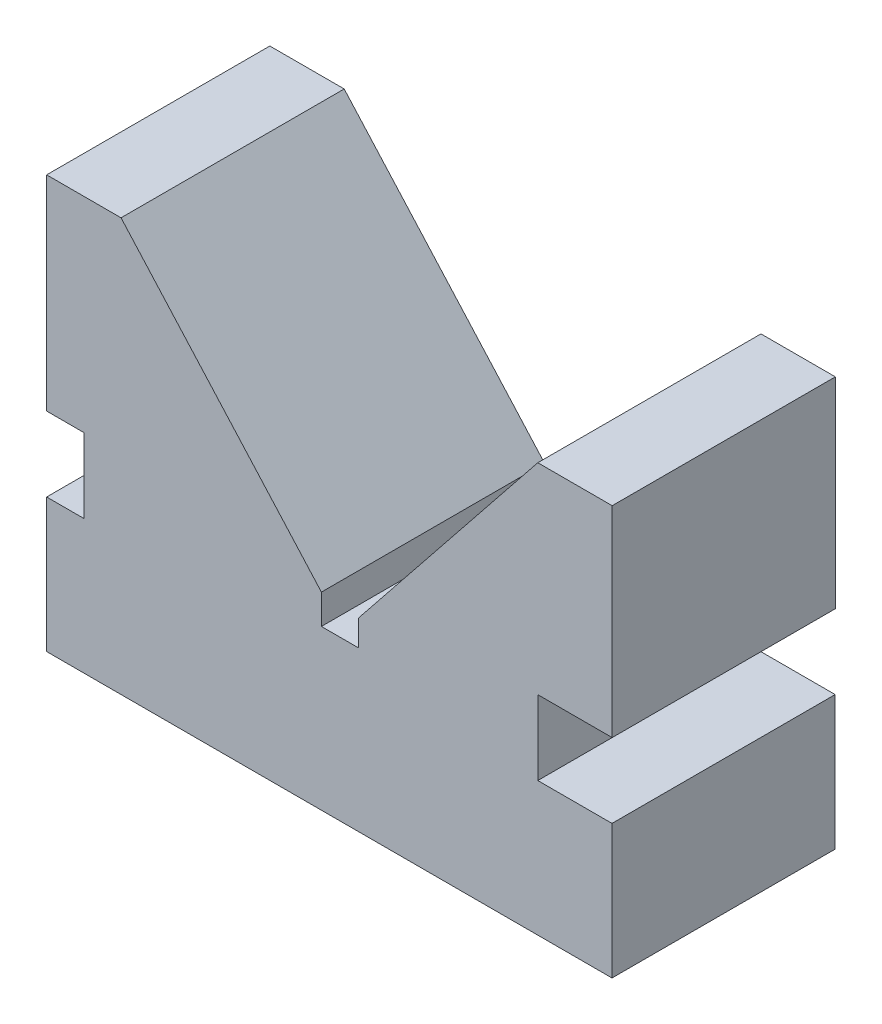
ISO-10303-21;
HEADER;
FILE_DESCRIPTION(('STEP AP214'),'2;1');
FILE_NAME('part.step','',(''),(''),'','','');
FILE_SCHEMA(('AUTOMOTIVE_DESIGN { 1 0 10303 214 1 1 1 1 }'));
ENDSEC;
DATA;
#1=APPLICATION_CONTEXT('core data for automotive mechanical design processes');
#2=APPLICATION_PROTOCOL_DEFINITION('international standard','automotive_design',2000,#1);
#3=PRODUCT_CONTEXT('',#1,'mechanical');
#4=PRODUCT('Part','Part','',(#3));
#5=PRODUCT_RELATED_PRODUCT_CATEGORY('part','',(#4));
#6=PRODUCT_DEFINITION_FORMATION('','',#4);
#7=PRODUCT_DEFINITION_CONTEXT('part definition',#1,'design');
#8=PRODUCT_DEFINITION('design','',#6,#7);
#9=PRODUCT_DEFINITION_SHAPE('','',#8);
#10=(LENGTH_UNIT() NAMED_UNIT(*) SI_UNIT(.MILLI.,.METRE.));
#11=(NAMED_UNIT(*) PLANE_ANGLE_UNIT() SI_UNIT($,.RADIAN.));
#12=(NAMED_UNIT(*) SI_UNIT($,.STERADIAN.) SOLID_ANGLE_UNIT());
#13=UNCERTAINTY_MEASURE_WITH_UNIT(LENGTH_MEASURE(1.E-05),#10,'distance_accuracy_value','');
#14=(GEOMETRIC_REPRESENTATION_CONTEXT(3) GLOBAL_UNCERTAINTY_ASSIGNED_CONTEXT((#13)) GLOBAL_UNIT_ASSIGNED_CONTEXT((#10,
#11,#12)) REPRESENTATION_CONTEXT('',''));
#15=CARTESIAN_POINT('',(0.,0.,0.));
#16=DIRECTION('',(0.,0.,1.));
#17=DIRECTION('',(1.,0.,0.));
#18=AXIS2_PLACEMENT_3D('',#15,#16,#17);
#19=CARTESIAN_POINT('',(5.,18.,30.));
#20=DIRECTION('',(0.,-1.,0.));
#21=DIRECTION('',(0.,0.,-1.));
#22=AXIS2_PLACEMENT_3D('',#19,#20,#21);
#23=PLANE('',#22);
#24=DIRECTION('',(-1.,0.,0.));
#25=VECTOR('',#24,1.);
#26=CARTESIAN_POINT('',(5.,18.,0.));
#27=LINE('',#26,#25);
#28=CARTESIAN_POINT('',(5.,18.,0.));
#29=VERTEX_POINT('',#28);
#30=CARTESIAN_POINT('',(0.,18.,0.));
#31=VERTEX_POINT('',#30);
#32=EDGE_CURVE('E201',#29,#31,#27,.T.);
#33=ORIENTED_EDGE('',*,*,#32,.T.);
#34=DIRECTION('',(0.,0.,-1.));
#35=VECTOR('',#34,1.);
#36=CARTESIAN_POINT('',(0.,18.,30.));
#37=LINE('',#36,#35);
#38=CARTESIAN_POINT('',(0.,18.,30.));
#39=VERTEX_POINT('',#38);
#40=EDGE_CURVE('E11',#39,#31,#37,.T.);
#41=ORIENTED_EDGE('',*,*,#40,.F.);
#42=DIRECTION('',(-1.,0.,0.));
#43=VECTOR('',#42,1.);
#44=CARTESIAN_POINT('',(5.,18.,30.));
#45=LINE('',#44,#43);
#46=CARTESIAN_POINT('',(5.,18.,30.));
#47=VERTEX_POINT('',#46);
#48=EDGE_CURVE('E253',#47,#39,#45,.T.);
#49=ORIENTED_EDGE('',*,*,#48,.F.);
#50=DIRECTION('',(0.,0.,-1.));
#51=VECTOR('',#50,1.);
#52=CARTESIAN_POINT('',(5.,18.,30.));
#53=LINE('',#52,#51);
#54=EDGE_CURVE('E197',#47,#29,#53,.T.);
#55=ORIENTED_EDGE('',*,*,#54,.T.);
#56=EDGE_LOOP('',(#33,#41,#49,#55));
#57=FACE_BOUND('',#56,.T.);
#58=ADVANCED_FACE('F40',(#57),#23,.F.);
#59=CARTESIAN_POINT('',(0.,18.,30.));
#60=DIRECTION('',(1.,0.,0.));
#61=DIRECTION('',(0.,1.,0.));
#62=AXIS2_PLACEMENT_3D('',#59,#60,#61);
#63=PLANE('',#62);
#64=DIRECTION('',(0.,-1.,0.));
#65=VECTOR('',#64,1.);
#66=CARTESIAN_POINT('',(0.,18.,0.));
#67=LINE('',#66,#65);
#68=CARTESIAN_POINT('',(0.,0.,0.));
#69=VERTEX_POINT('',#68);
#70=EDGE_CURVE('E205',#31,#69,#67,.T.);
#71=ORIENTED_EDGE('',*,*,#70,.T.);
#72=DIRECTION('',(0.,0.,-1.));
#73=VECTOR('',#72,1.);
#74=CARTESIAN_POINT('',(0.,0.,30.));
#75=LINE('',#74,#73);
#76=CARTESIAN_POINT('',(0.,0.,30.));
#77=VERTEX_POINT('',#76);
#78=EDGE_CURVE('E49',#77,#69,#75,.T.);
#79=ORIENTED_EDGE('',*,*,#78,.F.);
#80=DIRECTION('',(0.,-1.,0.));
#81=VECTOR('',#80,1.);
#82=CARTESIAN_POINT('',(0.,18.,30.));
#83=LINE('',#82,#81);
#84=EDGE_CURVE('E130',#39,#77,#83,.T.);
#85=ORIENTED_EDGE('',*,*,#84,.F.);
#86=ORIENTED_EDGE('',*,*,#40,.T.);
#87=EDGE_LOOP('',(#71,#79,#85,#86));
#88=FACE_BOUND('',#87,.T.);
#89=ADVANCED_FACE('F389',(#88),#63,.F.);
#90=CARTESIAN_POINT('',(0.,0.,30.));
#91=DIRECTION('',(0.,1.,0.));
#92=DIRECTION('',(0.,0.,1.));
#93=AXIS2_PLACEMENT_3D('',#90,#91,#92);
#94=PLANE('',#93);
#95=DIRECTION('',(1.,0.,0.));
#96=VECTOR('',#95,1.);
#97=CARTESIAN_POINT('',(0.,0.,0.));
#98=LINE('',#97,#96);
#99=CARTESIAN_POINT('',(76.,0.,0.));
#100=VERTEX_POINT('',#99);
#101=EDGE_CURVE('E208',#69,#100,#98,.T.);
#102=ORIENTED_EDGE('',*,*,#101,.T.);
#103=DIRECTION('',(0.,0.,-1.));
#104=VECTOR('',#103,1.);
#105=CARTESIAN_POINT('',(76.,0.,30.));
#106=LINE('',#105,#104);
#107=CARTESIAN_POINT('',(76.,0.,30.));
#108=VERTEX_POINT('',#107);
#109=EDGE_CURVE('E304',#108,#100,#106,.T.);
#110=ORIENTED_EDGE('',*,*,#109,.F.);
#111=DIRECTION('',(1.,0.,0.));
#112=VECTOR('',#111,1.);
#113=CARTESIAN_POINT('',(0.,0.,30.));
#114=LINE('',#113,#112);
#115=EDGE_CURVE('E314',#77,#108,#114,.T.);
#116=ORIENTED_EDGE('',*,*,#115,.F.);
#117=ORIENTED_EDGE('',*,*,#78,.T.);
#118=EDGE_LOOP('',(#102,#110,#116,#117));
#119=FACE_BOUND('',#118,.T.);
#120=ADVANCED_FACE('F312',(#119),#94,.F.);
#121=CARTESIAN_POINT('',(76.,0.,30.));
#122=DIRECTION('',(-1.,0.,0.));
#123=DIRECTION('',(0.,0.,1.));
#124=AXIS2_PLACEMENT_3D('',#121,#122,#123);
#125=PLANE('',#124);
#126=DIRECTION('',(0.,1.,0.));
#127=VECTOR('',#126,1.);
#128=CARTESIAN_POINT('',(76.,0.,0.));
#129=LINE('',#128,#127);
#130=CARTESIAN_POINT('',(76.,18.,0.));
#131=VERTEX_POINT('',#130);
#132=EDGE_CURVE('E211',#100,#131,#129,.T.);
#133=ORIENTED_EDGE('',*,*,#132,.T.);
#134=DIRECTION('',(0.,0.,-1.));
#135=VECTOR('',#134,1.);
#136=CARTESIAN_POINT('',(76.,18.,30.));
#137=LINE('',#136,#135);
#138=CARTESIAN_POINT('',(76.,18.,30.));
#139=VERTEX_POINT('',#138);
#140=EDGE_CURVE('E300',#139,#131,#137,.T.);
#141=ORIENTED_EDGE('',*,*,#140,.F.);
#142=DIRECTION('',(0.,1.,0.));
#143=VECTOR('',#142,1.);
#144=CARTESIAN_POINT('',(76.,0.,30.));
#145=LINE('',#144,#143);
#146=EDGE_CURVE('E333',#108,#139,#145,.T.);
#147=ORIENTED_EDGE('',*,*,#146,.F.);
#148=ORIENTED_EDGE('',*,*,#109,.T.);
#149=EDGE_LOOP('',(#133,#141,#147,#148));
#150=FACE_BOUND('',#149,.T.);
#151=ADVANCED_FACE('F323',(#150),#125,.F.);
#152=CARTESIAN_POINT('',(76.,18.,30.));
#153=DIRECTION('',(0.,-1.,0.));
#154=DIRECTION('',(0.,0.,-1.));
#155=AXIS2_PLACEMENT_3D('',#152,#153,#154);
#156=PLANE('',#155);
#157=DIRECTION('',(-1.,0.,0.));
#158=VECTOR('',#157,1.);
#159=CARTESIAN_POINT('',(76.,18.,0.));
#160=LINE('',#159,#158);
#161=CARTESIAN_POINT('',(66.0238663484487,18.,0.));
#162=VERTEX_POINT('',#161);
#163=EDGE_CURVE('E214',#131,#162,#160,.T.);
#164=ORIENTED_EDGE('',*,*,#163,.T.);
#165=DIRECTION('',(0.,0.,-1.));
#166=VECTOR('',#165,1.);
#167=CARTESIAN_POINT('',(66.0238663484487,18.,30.));
#168=LINE('',#167,#166);
#169=CARTESIAN_POINT('',(66.0238663484487,18.,30.));
#170=VERTEX_POINT('',#169);
#171=EDGE_CURVE('E296',#170,#162,#168,.T.);
#172=ORIENTED_EDGE('',*,*,#171,.F.);
#173=DIRECTION('',(-1.,0.,0.));
#174=VECTOR('',#173,1.);
#175=CARTESIAN_POINT('',(76.,18.,30.));
#176=LINE('',#175,#174);
#177=EDGE_CURVE('E329',#139,#170,#176,.T.);
#178=ORIENTED_EDGE('',*,*,#177,.F.);
#179=ORIENTED_EDGE('',*,*,#140,.T.);
#180=EDGE_LOOP('',(#164,#172,#178,#179));
#181=FACE_BOUND('',#180,.T.);
#182=ADVANCED_FACE('F327',(#181),#156,.F.);
#183=CARTESIAN_POINT('',(66.0238663484487,18.,30.));
#184=DIRECTION('',(-1.,0.,0.));
#185=DIRECTION('',(0.,0.,1.));
#186=AXIS2_PLACEMENT_3D('',#183,#184,#185);
#187=PLANE('',#186);
#188=DIRECTION('',(0.,1.,0.));
#189=VECTOR('',#188,1.);
#190=CARTESIAN_POINT('',(66.0238663484487,18.,0.));
#191=LINE('',#190,#189);
#192=CARTESIAN_POINT('',(66.0238663484487,28.,0.));
#193=VERTEX_POINT('',#192);
#194=EDGE_CURVE('E217',#162,#193,#191,.T.);
#195=ORIENTED_EDGE('',*,*,#194,.T.);
#196=DIRECTION('',(0.,0.,-1.));
#197=VECTOR('',#196,1.);
#198=CARTESIAN_POINT('',(66.0238663484487,28.,30.));
#199=LINE('',#198,#197);
#200=CARTESIAN_POINT('',(66.0238663484487,28.,30.));
#201=VERTEX_POINT('',#200);
#202=EDGE_CURVE('E292',#201,#193,#199,.T.);
#203=ORIENTED_EDGE('',*,*,#202,.F.);
#204=DIRECTION('',(0.,1.,0.));
#205=VECTOR('',#204,1.);
#206=CARTESIAN_POINT('',(66.0238663484487,18.,30.));
#207=LINE('',#206,#205);
#208=EDGE_CURVE('E332',#170,#201,#207,.T.);
#209=ORIENTED_EDGE('',*,*,#208,.F.);
#210=ORIENTED_EDGE('',*,*,#171,.T.);
#211=EDGE_LOOP('',(#195,#203,#209,#210));
#212=FACE_BOUND('',#211,.T.);
#213=ADVANCED_FACE('F402',(#212),#187,.F.);
#214=CARTESIAN_POINT('',(66.0238663484487,28.,30.));
#215=DIRECTION('',(0.,1.,0.));
#216=DIRECTION('',(0.,0.,1.));
#217=AXIS2_PLACEMENT_3D('',#214,#215,#216);
#218=PLANE('',#217);
#219=DIRECTION('',(1.,0.,0.));
#220=VECTOR('',#219,1.);
#221=CARTESIAN_POINT('',(66.0238663484487,28.,0.));
#222=LINE('',#221,#220);
#223=CARTESIAN_POINT('',(76.0238663484487,28.,0.));
#224=VERTEX_POINT('',#223);
#225=EDGE_CURVE('E220',#193,#224,#222,.T.);
#226=ORIENTED_EDGE('',*,*,#225,.T.);
#227=DIRECTION('',(0.,0.,-1.));
#228=VECTOR('',#227,1.);
#229=CARTESIAN_POINT('',(76.0238663484487,28.,30.));
#230=LINE('',#229,#228);
#231=CARTESIAN_POINT('',(76.0238663484487,28.,30.));
#232=VERTEX_POINT('',#231);
#233=EDGE_CURVE('E288',#232,#224,#230,.T.);
#234=ORIENTED_EDGE('',*,*,#233,.F.);
#235=DIRECTION('',(1.,0.,0.));
#236=VECTOR('',#235,1.);
#237=CARTESIAN_POINT('',(66.0238663484487,28.,30.));
#238=LINE('',#237,#236);
#239=EDGE_CURVE('E337',#201,#232,#238,.T.);
#240=ORIENTED_EDGE('',*,*,#239,.F.);
#241=ORIENTED_EDGE('',*,*,#202,.T.);
#242=EDGE_LOOP('',(#226,#234,#240,#241));
#243=FACE_BOUND('',#242,.T.);
#244=ADVANCED_FACE('F405',(#243),#218,.F.);
#245=CARTESIAN_POINT('',(76.0238663484487,28.,30.));
#246=DIRECTION('',(-1.,0.,0.));
#247=DIRECTION('',(0.,0.,1.));
#248=AXIS2_PLACEMENT_3D('',#245,#246,#247);
#249=PLANE('',#248);
#250=DIRECTION('',(0.,1.,0.));
#251=VECTOR('',#250,1.);
#252=CARTESIAN_POINT('',(76.0238663484487,28.,0.));
#253=LINE('',#252,#251);
#254=CARTESIAN_POINT('',(76.0238663484487,55.,0.));
#255=VERTEX_POINT('',#254);
#256=EDGE_CURVE('E223',#224,#255,#253,.T.);
#257=ORIENTED_EDGE('',*,*,#256,.T.);
#258=DIRECTION('',(0.,0.,-1.));
#259=VECTOR('',#258,1.);
#260=CARTESIAN_POINT('',(76.0238663484487,55.,30.));
#261=LINE('',#260,#259);
#262=CARTESIAN_POINT('',(76.0238663484487,55.,30.));
#263=VERTEX_POINT('',#262);
#264=EDGE_CURVE('E284',#263,#255,#261,.T.);
#265=ORIENTED_EDGE('',*,*,#264,.F.);
#266=DIRECTION('',(0.,1.,0.));
#267=VECTOR('',#266,1.);
#268=CARTESIAN_POINT('',(76.0238663484487,28.,30.));
#269=LINE('',#268,#267);
#270=EDGE_CURVE('E344',#232,#263,#269,.T.);
#271=ORIENTED_EDGE('',*,*,#270,.F.);
#272=ORIENTED_EDGE('',*,*,#233,.T.);
#273=EDGE_LOOP('',(#257,#265,#271,#272));
#274=FACE_BOUND('',#273,.T.);
#275=ADVANCED_FACE('F409',(#274),#249,.F.);
#276=CARTESIAN_POINT('',(76.0238663484487,55.,30.));
#277=DIRECTION('',(0.,-1.,0.));
#278=DIRECTION('',(0.,0.,-1.));
#279=AXIS2_PLACEMENT_3D('',#276,#277,#278);
#280=PLANE('',#279);
#281=DIRECTION('',(-1.,0.,0.));
#282=VECTOR('',#281,1.);
#283=CARTESIAN_POINT('',(76.0238663484487,55.,0.));
#284=LINE('',#283,#282);
#285=CARTESIAN_POINT('',(66.0238663484487,55.,0.));
#286=VERTEX_POINT('',#285);
#287=EDGE_CURVE('E226',#255,#286,#284,.T.);
#288=ORIENTED_EDGE('',*,*,#287,.T.);
#289=DIRECTION('',(0.,0.,-1.));
#290=VECTOR('',#289,1.);
#291=CARTESIAN_POINT('',(66.0238663484487,55.,30.));
#292=LINE('',#291,#290);
#293=CARTESIAN_POINT('',(66.0238663484487,55.,30.));
#294=VERTEX_POINT('',#293);
#295=EDGE_CURVE('E280',#294,#286,#292,.T.);
#296=ORIENTED_EDGE('',*,*,#295,.F.);
#297=DIRECTION('',(-1.,0.,0.));
#298=VECTOR('',#297,1.);
#299=CARTESIAN_POINT('',(76.0238663484487,55.,30.));
#300=LINE('',#299,#298);
#301=EDGE_CURVE('E347',#263,#294,#300,.T.);
#302=ORIENTED_EDGE('',*,*,#301,.F.);
#303=ORIENTED_EDGE('',*,*,#264,.T.);
#304=EDGE_LOOP('',(#288,#296,#302,#303));
#305=FACE_BOUND('',#304,.T.);
#306=ADVANCED_FACE('F413',(#305),#280,.F.);
#307=CARTESIAN_POINT('',(66.0238663484487,55.,30.));
#308=DIRECTION('',(0.780862770905143,-0.624702595651997,0.));
#309=DIRECTION('',(0.624702595651997,0.780862770905143,0.));
#310=AXIS2_PLACEMENT_3D('',#307,#308,#309);
#311=PLANE('',#310);
#312=DIRECTION('',(-0.624702595651997,-0.780862770905142,0.));
#313=VECTOR('',#312,1.);
#314=CARTESIAN_POINT('',(66.0238663484487,55.,0.));
#315=LINE('',#314,#313);
#316=CARTESIAN_POINT('',(41.9355608591886,24.890214797136,0.));
#317=VERTEX_POINT('',#316);
#318=EDGE_CURVE('E229',#286,#317,#315,.T.);
#319=ORIENTED_EDGE('',*,*,#318,.T.);
#320=DIRECTION('',(0.,0.,-1.));
#321=VECTOR('',#320,1.);
#322=CARTESIAN_POINT('',(41.9355608591886,24.890214797136,30.));
#323=LINE('',#322,#321);
#324=CARTESIAN_POINT('',(41.9355608591886,24.890214797136,30.));
#325=VERTEX_POINT('',#324);
#326=EDGE_CURVE('E276',#325,#317,#323,.T.);
#327=ORIENTED_EDGE('',*,*,#326,.F.);
#328=DIRECTION('',(-0.624702595651997,-0.780862770905142,0.));
#329=VECTOR('',#328,1.);
#330=CARTESIAN_POINT('',(66.0238663484487,55.,30.));
#331=LINE('',#330,#329);
#332=EDGE_CURVE('E350',#294,#325,#331,.T.);
#333=ORIENTED_EDGE('',*,*,#332,.F.);
#334=ORIENTED_EDGE('',*,*,#295,.T.);
#335=EDGE_LOOP('',(#319,#327,#333,#334));
#336=FACE_BOUND('',#335,.T.);
#337=ADVANCED_FACE('F417',(#336),#311,.F.);
#338=CARTESIAN_POINT('',(41.9355608591886,24.890214797136,30.));
#339=DIRECTION('',(1.,0.,0.));
#340=DIRECTION('',(0.,0.,-1.));
#341=AXIS2_PLACEMENT_3D('',#338,#339,#340);
#342=PLANE('',#341);
#343=DIRECTION('',(0.,-1.,0.));
#344=VECTOR('',#343,1.);
#345=CARTESIAN_POINT('',(41.9355608591886,24.890214797136,0.));
#346=LINE('',#345,#344);
#347=CARTESIAN_POINT('',(41.9355608591886,21.3937947494033,0.));
#348=VERTEX_POINT('',#347);
#349=EDGE_CURVE('E232',#317,#348,#346,.T.);
#350=ORIENTED_EDGE('',*,*,#349,.T.);
#351=DIRECTION('',(0.,0.,-1.));
#352=VECTOR('',#351,1.);
#353=CARTESIAN_POINT('',(41.9355608591886,21.3937947494033,30.));
#354=LINE('',#353,#352);
#355=CARTESIAN_POINT('',(41.9355608591886,21.3937947494033,30.));
#356=VERTEX_POINT('',#355);
#357=EDGE_CURVE('E272',#356,#348,#354,.T.);
#358=ORIENTED_EDGE('',*,*,#357,.F.);
#359=DIRECTION('',(0.,-1.,0.));
#360=VECTOR('',#359,1.);
#361=CARTESIAN_POINT('',(41.9355608591886,24.890214797136,30.));
#362=LINE('',#361,#360);
#363=EDGE_CURVE('E353',#325,#356,#362,.T.);
#364=ORIENTED_EDGE('',*,*,#363,.F.);
#365=ORIENTED_EDGE('',*,*,#326,.T.);
#366=EDGE_LOOP('',(#350,#358,#364,#365));
#367=FACE_BOUND('',#366,.T.);
#368=ADVANCED_FACE('F421',(#367),#342,.F.);
#369=CARTESIAN_POINT('',(41.9355608591886,21.3937947494033,30.));
#370=DIRECTION('',(0.,-1.,0.));
#371=DIRECTION('',(1.,0.,0.));
#372=AXIS2_PLACEMENT_3D('',#369,#370,#371);
#373=PLANE('',#372);
#374=DIRECTION('',(-1.,0.,0.));
#375=VECTOR('',#374,1.);
#376=CARTESIAN_POINT('',(41.9355608591886,21.3937947494033,0.));
#377=LINE('',#376,#375);
#378=CARTESIAN_POINT('',(36.9355608591886,21.3937947494033,0.));
#379=VERTEX_POINT('',#378);
#380=EDGE_CURVE('E235',#348,#379,#377,.T.);
#381=ORIENTED_EDGE('',*,*,#380,.T.);
#382=DIRECTION('',(0.,0.,-1.));
#383=VECTOR('',#382,1.);
#384=CARTESIAN_POINT('',(36.9355608591886,21.3937947494033,30.));
#385=LINE('',#384,#383);
#386=CARTESIAN_POINT('',(36.9355608591886,21.3937947494033,30.));
#387=VERTEX_POINT('',#386);
#388=EDGE_CURVE('E268',#387,#379,#385,.T.);
#389=ORIENTED_EDGE('',*,*,#388,.F.);
#390=DIRECTION('',(-1.,0.,0.));
#391=VECTOR('',#390,1.);
#392=CARTESIAN_POINT('',(41.9355608591886,21.3937947494033,30.));
#393=LINE('',#392,#391);
#394=EDGE_CURVE('E356',#356,#387,#393,.T.);
#395=ORIENTED_EDGE('',*,*,#394,.F.);
#396=ORIENTED_EDGE('',*,*,#357,.T.);
#397=EDGE_LOOP('',(#381,#389,#395,#396));
#398=FACE_BOUND('',#397,.T.);
#399=ADVANCED_FACE('F425',(#398),#373,.F.);
#400=CARTESIAN_POINT('',(36.9355608591886,21.3937947494033,30.));
#401=DIRECTION('',(-1.,0.,0.));
#402=DIRECTION('',(0.,0.,1.));
#403=AXIS2_PLACEMENT_3D('',#400,#401,#402);
#404=PLANE('',#403);
#405=DIRECTION('',(0.,1.,0.));
#406=VECTOR('',#405,1.);
#407=CARTESIAN_POINT('',(36.9355608591886,21.3937947494033,0.));
#408=LINE('',#407,#406);
#409=CARTESIAN_POINT('',(36.9355608591886,25.3937947494033,0.));
#410=VERTEX_POINT('',#409);
#411=EDGE_CURVE('E238',#379,#410,#408,.T.);
#412=ORIENTED_EDGE('',*,*,#411,.T.);
#413=DIRECTION('',(0.,0.,-1.));
#414=VECTOR('',#413,1.);
#415=CARTESIAN_POINT('',(36.9355608591886,25.3937947494033,30.));
#416=LINE('',#415,#414);
#417=CARTESIAN_POINT('',(36.9355608591886,25.3937947494033,30.));
#418=VERTEX_POINT('',#417);
#419=EDGE_CURVE('E264',#418,#410,#416,.T.);
#420=ORIENTED_EDGE('',*,*,#419,.F.);
#421=DIRECTION('',(0.,1.,0.));
#422=VECTOR('',#421,1.);
#423=CARTESIAN_POINT('',(36.9355608591886,21.3937947494033,30.));
#424=LINE('',#423,#422);
#425=EDGE_CURVE('E359',#387,#418,#424,.T.);
#426=ORIENTED_EDGE('',*,*,#425,.F.);
#427=ORIENTED_EDGE('',*,*,#388,.T.);
#428=EDGE_LOOP('',(#412,#420,#426,#427));
#429=FACE_BOUND('',#428,.T.);
#430=ADVANCED_FACE('F429',(#429),#404,.F.);
#431=CARTESIAN_POINT('',(36.9355608591886,25.3937947494033,30.));
#432=DIRECTION('',(-0.745300022871503,-0.666729237327821,0.));
#433=DIRECTION('',(0.666729237327821,-0.745300022871503,0.));
#434=AXIS2_PLACEMENT_3D('',#431,#432,#433);
#435=PLANE('',#434);
#436=DIRECTION('',(-0.666729237327821,0.745300022871503,0.));
#437=VECTOR('',#436,1.);
#438=CARTESIAN_POINT('',(36.9355608591886,25.3937947494033,0.));
#439=LINE('',#438,#437);
#440=CARTESIAN_POINT('',(10.,55.5035799522673,0.));
#441=VERTEX_POINT('',#440);
#442=EDGE_CURVE('E241',#410,#441,#439,.T.);
#443=ORIENTED_EDGE('',*,*,#442,.T.);
#444=DIRECTION('',(0.,0.,-1.));
#445=VECTOR('',#444,1.);
#446=CARTESIAN_POINT('',(10.,55.5035799522673,30.));
#447=LINE('',#446,#445);
#448=CARTESIAN_POINT('',(10.,55.5035799522673,30.));
#449=VERTEX_POINT('',#448);
#450=EDGE_CURVE('E260',#449,#441,#447,.T.);
#451=ORIENTED_EDGE('',*,*,#450,.F.);
#452=DIRECTION('',(-0.666729237327821,0.745300022871503,0.));
#453=VECTOR('',#452,1.);
#454=CARTESIAN_POINT('',(36.9355608591886,25.3937947494033,30.));
#455=LINE('',#454,#453);
#456=EDGE_CURVE('E362',#418,#449,#455,.T.);
#457=ORIENTED_EDGE('',*,*,#456,.F.);
#458=ORIENTED_EDGE('',*,*,#419,.T.);
#459=EDGE_LOOP('',(#443,#451,#457,#458));
#460=FACE_BOUND('',#459,.T.);
#461=ADVANCED_FACE('F370',(#460),#435,.F.);
#462=CARTESIAN_POINT('',(10.,55.5035799522673,30.));
#463=DIRECTION('',(0.,-1.,0.));
#464=DIRECTION('',(0.,0.,-1.));
#465=AXIS2_PLACEMENT_3D('',#462,#463,#464);
#466=PLANE('',#465);
#467=DIRECTION('',(-1.,0.,0.));
#468=VECTOR('',#467,1.);
#469=CARTESIAN_POINT('',(10.,55.5035799522673,0.));
#470=LINE('',#469,#468);
#471=CARTESIAN_POINT('',(0.,55.5035799522673,0.));
#472=VERTEX_POINT('',#471);
#473=EDGE_CURVE('E244',#441,#472,#470,.T.);
#474=ORIENTED_EDGE('',*,*,#473,.T.);
#475=DIRECTION('',(0.,0.,-1.));
#476=VECTOR('',#475,1.);
#477=CARTESIAN_POINT('',(0.,55.5035799522673,30.));
#478=LINE('',#477,#476);
#479=CARTESIAN_POINT('',(0.,55.5035799522673,30.));
#480=VERTEX_POINT('',#479);
#481=EDGE_CURVE('E190',#480,#472,#478,.T.);
#482=ORIENTED_EDGE('',*,*,#481,.F.);
#483=DIRECTION('',(-1.,0.,0.));
#484=VECTOR('',#483,1.);
#485=CARTESIAN_POINT('',(10.,55.5035799522673,30.));
#486=LINE('',#485,#484);
#487=EDGE_CURVE('E179',#449,#480,#486,.T.);
#488=ORIENTED_EDGE('',*,*,#487,.F.);
#489=ORIENTED_EDGE('',*,*,#450,.T.);
#490=EDGE_LOOP('',(#474,#482,#488,#489));
#491=FACE_BOUND('',#490,.T.);
#492=ADVANCED_FACE('F374',(#491),#466,.F.);
#493=CARTESIAN_POINT('',(0.,55.5035799522673,30.));
#494=DIRECTION('',(1.,0.,0.));
#495=DIRECTION('',(0.,1.,0.));
#496=AXIS2_PLACEMENT_3D('',#493,#494,#495);
#497=PLANE('',#496);
#498=DIRECTION('',(0.,-1.,0.));
#499=VECTOR('',#498,1.);
#500=CARTESIAN_POINT('',(0.,55.5035799522673,0.));
#501=LINE('',#500,#499);
#502=CARTESIAN_POINT('',(0.,28.,0.));
#503=VERTEX_POINT('',#502);
#504=EDGE_CURVE('E188',#472,#503,#501,.T.);
#505=ORIENTED_EDGE('',*,*,#504,.T.);
#506=DIRECTION('',(0.,0.,-1.));
#507=VECTOR('',#506,1.);
#508=CARTESIAN_POINT('',(0.,28.,30.));
#509=LINE('',#508,#507);
#510=CARTESIAN_POINT('',(0.,28.,30.));
#511=VERTEX_POINT('',#510);
#512=EDGE_CURVE('E185',#511,#503,#509,.T.);
#513=ORIENTED_EDGE('',*,*,#512,.F.);
#514=DIRECTION('',(0.,-1.,0.));
#515=VECTOR('',#514,1.);
#516=CARTESIAN_POINT('',(0.,55.5035799522673,30.));
#517=LINE('',#516,#515);
#518=EDGE_CURVE('E173',#480,#511,#517,.T.);
#519=ORIENTED_EDGE('',*,*,#518,.F.);
#520=ORIENTED_EDGE('',*,*,#481,.T.);
#521=EDGE_LOOP('',(#505,#513,#519,#520));
#522=FACE_BOUND('',#521,.T.);
#523=ADVANCED_FACE('F186',(#522),#497,.F.);
#524=CARTESIAN_POINT('',(0.,28.,30.));
#525=DIRECTION('',(0.,1.,0.));
#526=DIRECTION('',(0.,0.,1.));
#527=AXIS2_PLACEMENT_3D('',#524,#525,#526);
#528=PLANE('',#527);
#529=DIRECTION('',(1.,0.,0.));
#530=VECTOR('',#529,1.);
#531=CARTESIAN_POINT('',(0.,28.,0.));
#532=LINE('',#531,#530);
#533=CARTESIAN_POINT('',(5.,28.,0.));
#534=VERTEX_POINT('',#533);
#535=EDGE_CURVE('E116',#503,#534,#532,.T.);
#536=ORIENTED_EDGE('',*,*,#535,.T.);
#537=DIRECTION('',(0.,0.,-1.));
#538=VECTOR('',#537,1.);
#539=CARTESIAN_POINT('',(5.,28.,30.));
#540=LINE('',#539,#538);
#541=CARTESIAN_POINT('',(5.,28.,30.));
#542=VERTEX_POINT('',#541);
#543=EDGE_CURVE('E191',#542,#534,#540,.T.);
#544=ORIENTED_EDGE('',*,*,#543,.F.);
#545=DIRECTION('',(1.,0.,0.));
#546=VECTOR('',#545,1.);
#547=CARTESIAN_POINT('',(0.,28.,30.));
#548=LINE('',#547,#546);
#549=EDGE_CURVE('E177',#511,#542,#548,.T.);
#550=ORIENTED_EDGE('',*,*,#549,.F.);
#551=ORIENTED_EDGE('',*,*,#512,.T.);
#552=EDGE_LOOP('',(#536,#544,#550,#551));
#553=FACE_BOUND('',#552,.T.);
#554=ADVANCED_FACE('F193',(#553),#528,.F.);
#555=CARTESIAN_POINT('',(5.,28.,30.));
#556=DIRECTION('',(1.,0.,0.));
#557=DIRECTION('',(0.,1.,0.));
#558=AXIS2_PLACEMENT_3D('',#555,#556,#557);
#559=PLANE('',#558);
#560=DIRECTION('',(0.,-1.,0.));
#561=VECTOR('',#560,1.);
#562=CARTESIAN_POINT('',(5.,28.,0.));
#563=LINE('',#562,#561);
#564=EDGE_CURVE('E122',#534,#29,#563,.T.);
#565=ORIENTED_EDGE('',*,*,#564,.T.);
#566=ORIENTED_EDGE('',*,*,#54,.F.);
#567=DIRECTION('',(0.,-1.,0.));
#568=VECTOR('',#567,1.);
#569=CARTESIAN_POINT('',(5.,28.,30.));
#570=LINE('',#569,#568);
#571=EDGE_CURVE('E57',#542,#47,#570,.T.);
#572=ORIENTED_EDGE('',*,*,#571,.F.);
#573=ORIENTED_EDGE('',*,*,#543,.T.);
#574=EDGE_LOOP('',(#565,#566,#572,#573));
#575=FACE_BOUND('',#574,.T.);
#576=ADVANCED_FACE('F378',(#575),#559,.F.);
#577=CARTESIAN_POINT('',(0.,0.,30.));
#578=DIRECTION('',(0.,0.,1.));
#579=DIRECTION('',(1.,0.,0.));
#580=AXIS2_PLACEMENT_3D('',#577,#578,#579);
#581=PLANE('',#580);
#582=ORIENTED_EDGE('',*,*,#48,.T.);
#583=ORIENTED_EDGE('',*,*,#84,.T.);
#584=ORIENTED_EDGE('',*,*,#115,.T.);
#585=ORIENTED_EDGE('',*,*,#146,.T.);
#586=ORIENTED_EDGE('',*,*,#177,.T.);
#587=ORIENTED_EDGE('',*,*,#208,.T.);
#588=ORIENTED_EDGE('',*,*,#239,.T.);
#589=ORIENTED_EDGE('',*,*,#270,.T.);
#590=ORIENTED_EDGE('',*,*,#301,.T.);
#591=ORIENTED_EDGE('',*,*,#332,.T.);
#592=ORIENTED_EDGE('',*,*,#363,.T.);
#593=ORIENTED_EDGE('',*,*,#394,.T.);
#594=ORIENTED_EDGE('',*,*,#425,.T.);
#595=ORIENTED_EDGE('',*,*,#456,.T.);
#596=ORIENTED_EDGE('',*,*,#487,.T.);
#597=ORIENTED_EDGE('',*,*,#518,.T.);
#598=ORIENTED_EDGE('',*,*,#549,.T.);
#599=ORIENTED_EDGE('',*,*,#571,.T.);
#600=EDGE_LOOP('',(#582,#583,#584,#585,#586,#587,#588,#589,#590,#591,#592,#593,#594,#595,#596,
#597,#598,#599));
#601=FACE_BOUND('',#600,.T.);
#602=ADVANCED_FACE('F175',(#601),#581,.T.);
#603=CARTESIAN_POINT('',(0.,0.,0.));
#604=DIRECTION('',(0.,0.,1.));
#605=DIRECTION('',(1.,0.,0.));
#606=AXIS2_PLACEMENT_3D('',#603,#604,#605);
#607=PLANE('',#606);
#608=ORIENTED_EDGE('',*,*,#32,.F.);
#609=ORIENTED_EDGE('',*,*,#564,.F.);
#610=ORIENTED_EDGE('',*,*,#535,.F.);
#611=ORIENTED_EDGE('',*,*,#504,.F.);
#612=ORIENTED_EDGE('',*,*,#473,.F.);
#613=ORIENTED_EDGE('',*,*,#442,.F.);
#614=ORIENTED_EDGE('',*,*,#411,.F.);
#615=ORIENTED_EDGE('',*,*,#380,.F.);
#616=ORIENTED_EDGE('',*,*,#349,.F.);
#617=ORIENTED_EDGE('',*,*,#318,.F.);
#618=ORIENTED_EDGE('',*,*,#287,.F.);
#619=ORIENTED_EDGE('',*,*,#256,.F.);
#620=ORIENTED_EDGE('',*,*,#225,.F.);
#621=ORIENTED_EDGE('',*,*,#194,.F.);
#622=ORIENTED_EDGE('',*,*,#163,.F.);
#623=ORIENTED_EDGE('',*,*,#132,.F.);
#624=ORIENTED_EDGE('',*,*,#101,.F.);
#625=ORIENTED_EDGE('',*,*,#70,.F.);
#626=EDGE_LOOP('',(#608,#609,#610,#611,#612,#613,#614,#615,#616,#617,#618,#619,#620,#621,#622,
#623,#624,#625));
#627=FACE_BOUND('',#626,.T.);
#628=ADVANCED_FACE('F318',(#627),#607,.F.);
#629=CLOSED_SHELL('',(#58,#89,#120,#151,#182,#213,#244,#275,#306,#337,#368,#399,#430,#461,#492,
#523,#554,#576,#602,#628));
#630=MANIFOLD_SOLID_BREP('B2',#629);
#631=ADVANCED_BREP_SHAPE_REPRESENTATION('',(#18,#630),#14);
#632=SHAPE_DEFINITION_REPRESENTATION(#9,#631);
ENDSEC;
END-ISO-10303-21;
